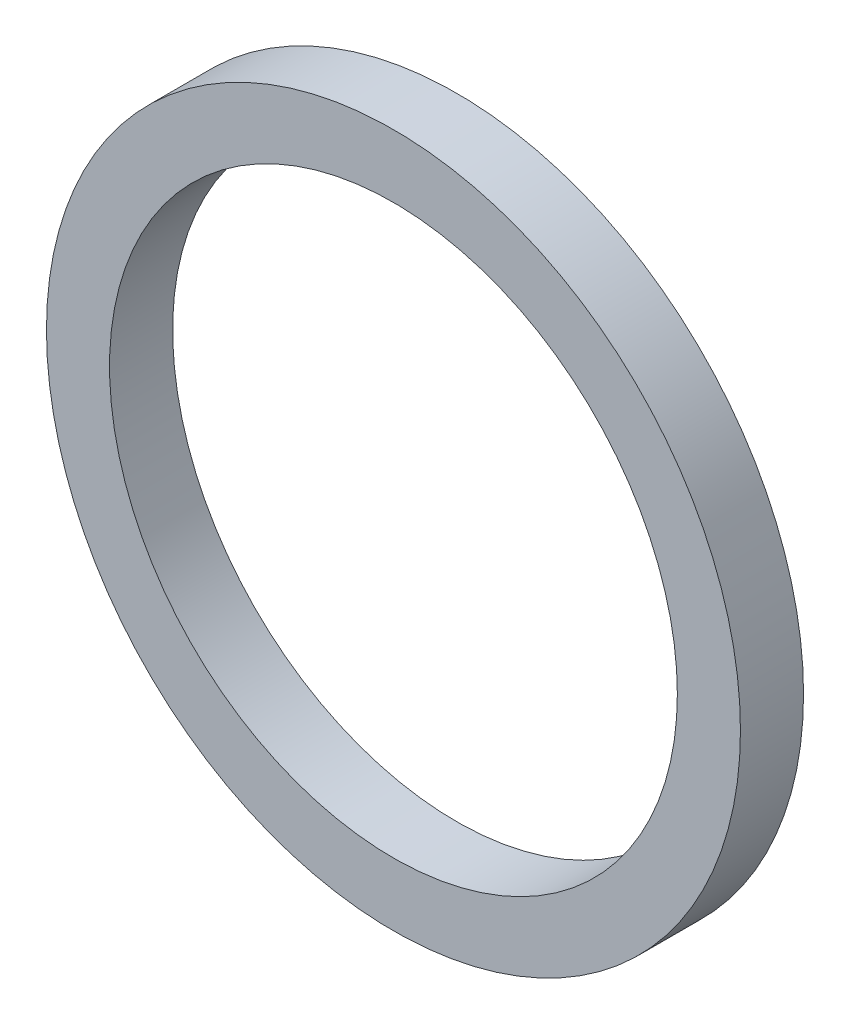
ISO-10303-21;
HEADER;
FILE_DESCRIPTION(('STEP AP214'),'2;1');
FILE_NAME('part.step','',(''),(''),'','','');
FILE_SCHEMA(('AUTOMOTIVE_DESIGN { 1 0 10303 214 1 1 1 1 }'));
ENDSEC;
DATA;
#1=APPLICATION_CONTEXT('core data for automotive mechanical design processes');
#2=APPLICATION_PROTOCOL_DEFINITION('international standard','automotive_design',2000,#1);
#3=PRODUCT_CONTEXT('',#1,'mechanical');
#4=PRODUCT('Part','Part','',(#3));
#5=PRODUCT_RELATED_PRODUCT_CATEGORY('part','',(#4));
#6=PRODUCT_DEFINITION_FORMATION('','',#4);
#7=PRODUCT_DEFINITION_CONTEXT('part definition',#1,'design');
#8=PRODUCT_DEFINITION('design','',#6,#7);
#9=PRODUCT_DEFINITION_SHAPE('','',#8);
#10=(LENGTH_UNIT() NAMED_UNIT(*) SI_UNIT(.MILLI.,.METRE.));
#11=(NAMED_UNIT(*) PLANE_ANGLE_UNIT() SI_UNIT($,.RADIAN.));
#12=(NAMED_UNIT(*) SI_UNIT($,.STERADIAN.) SOLID_ANGLE_UNIT());
#13=UNCERTAINTY_MEASURE_WITH_UNIT(LENGTH_MEASURE(1.E-05),#10,'distance_accuracy_value','');
#14=(GEOMETRIC_REPRESENTATION_CONTEXT(3) GLOBAL_UNCERTAINTY_ASSIGNED_CONTEXT((#13)) GLOBAL_UNIT_ASSIGNED_CONTEXT((#10,
#11,#12)) REPRESENTATION_CONTEXT('',''));
#15=CARTESIAN_POINT('',(0.,0.,0.));
#16=DIRECTION('',(0.,0.,1.));
#17=DIRECTION('',(1.,0.,0.));
#18=AXIS2_PLACEMENT_3D('',#15,#16,#17);
#19=CARTESIAN_POINT('',(0.,0.,10.));
#20=DIRECTION('',(0.,0.,1.));
#21=DIRECTION('',(1.,0.,0.));
#22=AXIS2_PLACEMENT_3D('',#19,#20,#21);
#23=PLANE('',#22);
#24=CARTESIAN_POINT('',(0.,0.,10.));
#25=DIRECTION('',(0.,0.,1.));
#26=DIRECTION('',(1.,0.,0.));
#27=AXIS2_PLACEMENT_3D('',#24,#25,#26);
#28=CIRCLE('',#27,55.);
#29=CARTESIAN_POINT('',(55.,0.,10.));
#30=VERTEX_POINT('',#29);
#31=EDGE_CURVE('E10',#30,#30,#28,.T.);
#32=ORIENTED_EDGE('',*,*,#31,.T.);
#33=EDGE_LOOP('',(#32));
#34=FACE_BOUND('',#33,.T.);
#35=CARTESIAN_POINT('',(0.,0.,10.));
#36=DIRECTION('',(0.,0.,1.));
#37=DIRECTION('',(1.,0.,0.));
#38=AXIS2_PLACEMENT_3D('',#35,#36,#37);
#39=CIRCLE('',#38,45.);
#40=CARTESIAN_POINT('',(45.,0.,10.));
#41=VERTEX_POINT('',#40);
#42=EDGE_CURVE('E46',#41,#41,#39,.T.);
#43=ORIENTED_EDGE('',*,*,#42,.F.);
#44=EDGE_LOOP('',(#43));
#45=FACE_BOUND('',#44,.T.);
#46=ADVANCED_FACE('F35',(#34,#45),#23,.T.);
#47=CARTESIAN_POINT('',(0.,0.,0.));
#48=DIRECTION('',(0.,0.,1.));
#49=DIRECTION('',(1.,0.,0.));
#50=AXIS2_PLACEMENT_3D('',#47,#48,#49);
#51=PLANE('',#50);
#52=CARTESIAN_POINT('',(0.,0.,0.));
#53=DIRECTION('',(0.,0.,1.));
#54=DIRECTION('',(1.,0.,0.));
#55=AXIS2_PLACEMENT_3D('',#52,#53,#54);
#56=CIRCLE('',#55,55.);
#57=CARTESIAN_POINT('',(55.,0.,0.));
#58=VERTEX_POINT('',#57);
#59=EDGE_CURVE('E39',#58,#58,#56,.T.);
#60=ORIENTED_EDGE('',*,*,#59,.F.);
#61=EDGE_LOOP('',(#60));
#62=FACE_BOUND('',#61,.T.);
#63=CARTESIAN_POINT('',(0.,0.,0.));
#64=DIRECTION('',(0.,0.,1.));
#65=DIRECTION('',(1.,0.,0.));
#66=AXIS2_PLACEMENT_3D('',#63,#64,#65);
#67=CIRCLE('',#66,45.);
#68=CARTESIAN_POINT('',(45.,0.,0.));
#69=VERTEX_POINT('',#68);
#70=EDGE_CURVE('E48',#69,#69,#67,.T.);
#71=ORIENTED_EDGE('',*,*,#70,.T.);
#72=EDGE_LOOP('',(#71));
#73=FACE_BOUND('',#72,.T.);
#74=ADVANCED_FACE('F58',(#62,#73),#51,.F.);
#75=CARTESIAN_POINT('',(0.,0.,10.));
#76=DIRECTION('',(0.,0.,-1.));
#77=DIRECTION('',(-1.,0.,0.));
#78=AXIS2_PLACEMENT_3D('',#75,#76,#77);
#79=CYLINDRICAL_SURFACE('',#78,55.);
#80=ORIENTED_EDGE('',*,*,#31,.F.);
#81=EDGE_LOOP('',(#80));
#82=FACE_BOUND('',#81,.T.);
#83=ORIENTED_EDGE('',*,*,#59,.T.);
#84=EDGE_LOOP('',(#83));
#85=FACE_BOUND('',#84,.T.);
#86=ADVANCED_FACE('F37',(#82,#85),#79,.T.);
#87=CARTESIAN_POINT('',(0.,0.,10.));
#88=DIRECTION('',(0.,0.,-1.));
#89=DIRECTION('',(-1.,0.,0.));
#90=AXIS2_PLACEMENT_3D('',#87,#88,#89);
#91=CYLINDRICAL_SURFACE('',#90,45.);
#92=ORIENTED_EDGE('',*,*,#42,.T.);
#93=EDGE_LOOP('',(#92));
#94=FACE_BOUND('',#93,.T.);
#95=ORIENTED_EDGE('',*,*,#70,.F.);
#96=EDGE_LOOP('',(#95));
#97=FACE_BOUND('',#96,.T.);
#98=ADVANCED_FACE('F54',(#94,#97),#91,.F.);
#99=CLOSED_SHELL('',(#46,#74,#86,#98));
#100=MANIFOLD_SOLID_BREP('B2',#99);
#101=ADVANCED_BREP_SHAPE_REPRESENTATION('',(#18,#100),#14);
#102=SHAPE_DEFINITION_REPRESENTATION(#9,#101);
ENDSEC;
END-ISO-10303-21;
